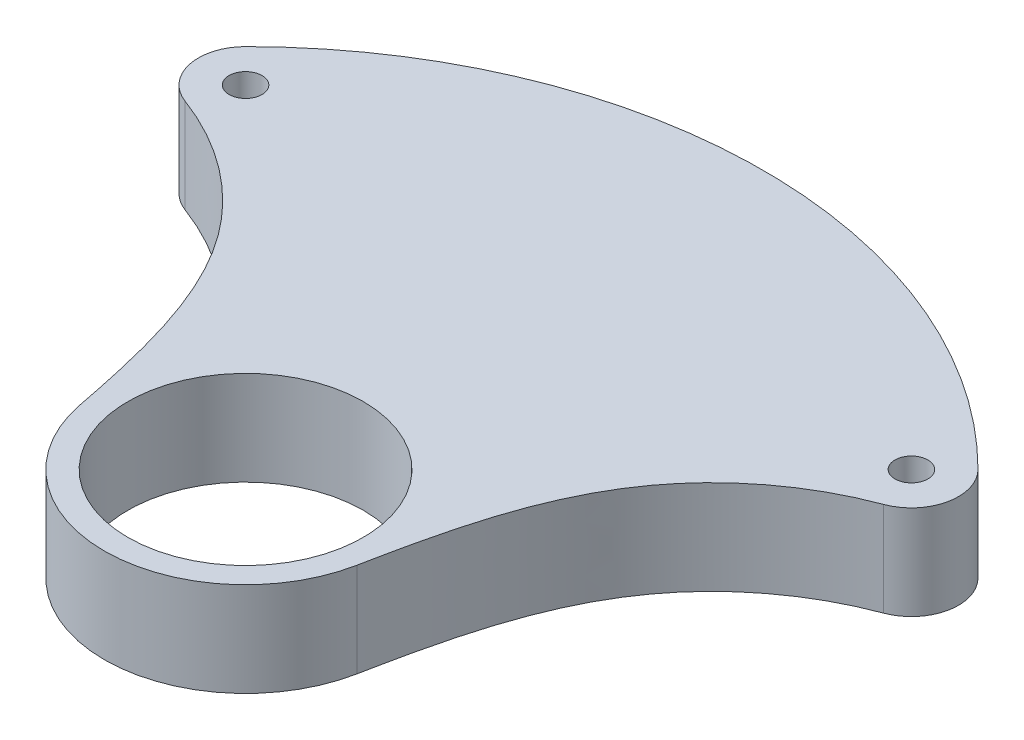
ISO-10303-21;
HEADER;
FILE_DESCRIPTION(('STEP AP214'),'2;1');
FILE_NAME('part.step','',(''),(''),'','','');
FILE_SCHEMA(('AUTOMOTIVE_DESIGN { 1 0 10303 214 1 1 1 1 }'));
ENDSEC;
DATA;
#1=APPLICATION_CONTEXT('core data for automotive mechanical design processes');
#2=APPLICATION_PROTOCOL_DEFINITION('international standard','automotive_design',2000,#1);
#3=PRODUCT_CONTEXT('',#1,'mechanical');
#4=PRODUCT('Part','Part','',(#3));
#5=PRODUCT_RELATED_PRODUCT_CATEGORY('part','',(#4));
#6=PRODUCT_DEFINITION_FORMATION('','',#4);
#7=PRODUCT_DEFINITION_CONTEXT('part definition',#1,'design');
#8=PRODUCT_DEFINITION('design','',#6,#7);
#9=PRODUCT_DEFINITION_SHAPE('','',#8);
#10=(LENGTH_UNIT() NAMED_UNIT(*) SI_UNIT(.MILLI.,.METRE.));
#11=(NAMED_UNIT(*) PLANE_ANGLE_UNIT() SI_UNIT($,.RADIAN.));
#12=(NAMED_UNIT(*) SI_UNIT($,.STERADIAN.) SOLID_ANGLE_UNIT());
#13=UNCERTAINTY_MEASURE_WITH_UNIT(LENGTH_MEASURE(1.E-05),#10,'distance_accuracy_value','');
#14=(GEOMETRIC_REPRESENTATION_CONTEXT(3) GLOBAL_UNCERTAINTY_ASSIGNED_CONTEXT((#13)) GLOBAL_UNIT_ASSIGNED_CONTEXT((#10,
#11,#12)) REPRESENTATION_CONTEXT('',''));
#15=CARTESIAN_POINT('',(0.,0.,0.));
#16=DIRECTION('',(0.,0.,1.));
#17=DIRECTION('',(1.,0.,0.));
#18=AXIS2_PLACEMENT_3D('',#15,#16,#17);
#19=CARTESIAN_POINT('',(35.3553390593274,10.,-35.3553390593273));
#20=DIRECTION('',(0.,-1.,0.));
#21=DIRECTION('',(0.,0.,-1.));
#22=AXIS2_PLACEMENT_3D('',#19,#20,#21);
#23=CYLINDRICAL_SURFACE('',#22,5.);
#24=CARTESIAN_POINT('',(35.3553390593274,0.,-35.3553390593273));
#25=DIRECTION('',(0.,1.,0.));
#26=DIRECTION('',(0.,0.,1.));
#27=AXIS2_PLACEMENT_3D('',#24,#25,#26);
#28=CIRCLE('',#27,5.);
#29=CARTESIAN_POINT('',(38.8908729652602,0.,-38.89087296526));
#30=VERTEX_POINT('',#29);
#31=CARTESIAN_POINT('',(37.1012695198472,0.,-30.6700720629834));
#32=VERTEX_POINT('',#31);
#33=EDGE_CURVE('E297',#30,#32,#28,.F.);
#34=ORIENTED_EDGE('',*,*,#33,.F.);
#35=DIRECTION('',(0.,-1.,0.));
#36=VECTOR('',#35,1.);
#37=CARTESIAN_POINT('',(38.8908729652602,10.,-38.89087296526));
#38=LINE('',#37,#36);
#39=CARTESIAN_POINT('',(38.8908729652602,10.,-38.89087296526));
#40=VERTEX_POINT('',#39);
#41=EDGE_CURVE('E169',#40,#30,#38,.T.);
#42=ORIENTED_EDGE('',*,*,#41,.F.);
#43=CARTESIAN_POINT('',(35.3553390593274,10.,-35.3553390593273));
#44=DIRECTION('',(0.,1.,0.));
#45=DIRECTION('',(0.,0.,1.));
#46=AXIS2_PLACEMENT_3D('',#43,#44,#45);
#47=CIRCLE('',#46,5.);
#48=CARTESIAN_POINT('',(37.1012695198472,10.,-30.6700720629834));
#49=VERTEX_POINT('',#48);
#50=EDGE_CURVE('E247',#40,#49,#47,.F.);
#51=ORIENTED_EDGE('',*,*,#50,.T.);
#52=DIRECTION('',(0.,-1.,0.));
#53=VECTOR('',#52,1.);
#54=CARTESIAN_POINT('',(37.1012695198472,10.,-30.6700720629834));
#55=LINE('',#54,#53);
#56=EDGE_CURVE('E12',#49,#32,#55,.T.);
#57=ORIENTED_EDGE('',*,*,#56,.T.);
#58=EDGE_LOOP('',(#34,#42,#51,#57));
#59=FACE_BOUND('',#58,.T.);
#60=ADVANCED_FACE('F158',(#59),#23,.T.);
#61=CARTESIAN_POINT('',(0.,10.,0.));
#62=DIRECTION('',(0.,-1.,0.));
#63=DIRECTION('',(0.,0.,-1.));
#64=AXIS2_PLACEMENT_3D('',#61,#62,#63);
#65=CYLINDRICAL_SURFACE('',#64,55.);
#66=CARTESIAN_POINT('',(0.,0.,0.));
#67=DIRECTION('',(0.,1.,0.));
#68=DIRECTION('',(0.,0.,1.));
#69=AXIS2_PLACEMENT_3D('',#66,#67,#68);
#70=CIRCLE('',#69,55.);
#71=CARTESIAN_POINT('',(-38.8908729652602,0.,-38.89087296526));
#72=VERTEX_POINT('',#71);
#73=EDGE_CURVE('E301',#30,#72,#70,.T.);
#74=ORIENTED_EDGE('',*,*,#73,.T.);
#75=DIRECTION('',(0.,-1.,0.));
#76=VECTOR('',#75,1.);
#77=CARTESIAN_POINT('',(-38.8908729652602,10.,-38.89087296526));
#78=LINE('',#77,#76);
#79=CARTESIAN_POINT('',(-38.8908729652602,10.,-38.89087296526));
#80=VERTEX_POINT('',#79);
#81=EDGE_CURVE('E228',#80,#72,#78,.T.);
#82=ORIENTED_EDGE('',*,*,#81,.F.);
#83=CARTESIAN_POINT('',(0.,10.,0.));
#84=DIRECTION('',(0.,1.,0.));
#85=DIRECTION('',(0.,0.,1.));
#86=AXIS2_PLACEMENT_3D('',#83,#84,#85);
#87=CIRCLE('',#86,55.);
#88=EDGE_CURVE('E237',#40,#80,#87,.T.);
#89=ORIENTED_EDGE('',*,*,#88,.F.);
#90=ORIENTED_EDGE('',*,*,#41,.T.);
#91=EDGE_LOOP('',(#74,#82,#89,#90));
#92=FACE_BOUND('',#91,.T.);
#93=ADVANCED_FACE('F265',(#92),#65,.T.);
#94=CARTESIAN_POINT('',(-37.1012695198472,10.,-30.6700720629834));
#95=CARTESIAN_POINT('',(-31.1214389404414,10.,-28.4417319565436));
#96=CARTESIAN_POINT('',(-19.5397140555229,10.,-19.3542532503672));
#97=CARTESIAN_POINT('',(-16.3006088585592,10.,-5.15524894452462));
#98=CARTESIAN_POINT('',(-14.7182727310145,10.,2.89351824177345));
#99=B_SPLINE_CURVE_WITH_KNOTS('',3,(#94,#95,#96,#97,#98),.UNSPECIFIED.,.F.,.F.,(4,1,4),(0.,
0.431745362513028,1.),.UNSPECIFIED.);
#100=DIRECTION('',(0.,-1.,0.));
#101=VECTOR('',#100,1.);
#102=SURFACE_OF_LINEAR_EXTRUSION('',#99,#101);
#103=CARTESIAN_POINT('',(-37.1012695198472,0.,-30.6700720629834));
#104=CARTESIAN_POINT('',(-31.1214389404414,0.,-28.4417319565436));
#105=CARTESIAN_POINT('',(-19.5397140555229,0.,-19.3542532503672));
#106=CARTESIAN_POINT('',(-16.3006088585592,0.,-5.15524894452462));
#107=CARTESIAN_POINT('',(-14.7182727310145,0.,2.89351824177345));
#108=B_SPLINE_CURVE_WITH_KNOTS('',3,(#103,#104,#105,#106,#107),.UNSPECIFIED.,.F.,.F.,(4,1,4),
(0.,0.431745362513028,1.),.UNSPECIFIED.);
#109=CARTESIAN_POINT('',(-37.1012695198472,0.,-30.6700720629834));
#110=VERTEX_POINT('',#109);
#111=CARTESIAN_POINT('',(-14.7182727310145,0.,2.89351824177345));
#112=VERTEX_POINT('',#111);
#113=EDGE_CURVE('E283',#110,#112,#108,.T.);
#114=ORIENTED_EDGE('',*,*,#113,.T.);
#115=DIRECTION('',(0.,-1.,0.));
#116=VECTOR('',#115,1.);
#117=CARTESIAN_POINT('',(-14.7182727310145,10.,2.89351824177345));
#118=LINE('',#117,#116);
#119=CARTESIAN_POINT('',(-14.7182727310145,10.,2.89351824177345));
#120=VERTEX_POINT('',#119);
#121=EDGE_CURVE('E197',#120,#112,#118,.T.);
#122=ORIENTED_EDGE('',*,*,#121,.F.);
#123=CARTESIAN_POINT('',(-37.1012695198472,10.,-30.6700720629834));
#124=VERTEX_POINT('',#123);
#125=EDGE_CURVE('E234',#124,#120,#99,.T.);
#126=ORIENTED_EDGE('',*,*,#125,.F.);
#127=DIRECTION('',(0.,-1.,0.));
#128=VECTOR('',#127,1.);
#129=CARTESIAN_POINT('',(-37.1012695198472,10.,-30.6700720629834));
#130=LINE('',#129,#128);
#131=EDGE_CURVE('E216',#124,#110,#130,.T.);
#132=ORIENTED_EDGE('',*,*,#131,.T.);
#133=EDGE_LOOP('',(#114,#122,#126,#132));
#134=FACE_BOUND('',#133,.T.);
#135=ADVANCED_FACE('F241',(#134),#102,.F.);
#136=CARTESIAN_POINT('',(37.1012695198472,10.,-30.6700720629834));
#137=CARTESIAN_POINT('',(31.1214389404414,10.,-28.4417319565436));
#138=CARTESIAN_POINT('',(19.5397140555229,10.,-19.3542532503672));
#139=CARTESIAN_POINT('',(16.3006088585592,10.,-5.15524894452462));
#140=CARTESIAN_POINT('',(14.7182727310145,10.,2.89351824177345));
#141=B_SPLINE_CURVE_WITH_KNOTS('',3,(#136,#137,#138,#139,#140),.UNSPECIFIED.,.F.,.F.,(4,1,4),
(0.,0.431745362513028,1.),.UNSPECIFIED.);
#142=DIRECTION('',(0.,-1.,0.));
#143=VECTOR('',#142,1.);
#144=SURFACE_OF_LINEAR_EXTRUSION('',#141,#143);
#145=CARTESIAN_POINT('',(37.1012695198472,0.,-30.6700720629834));
#146=CARTESIAN_POINT('',(31.1214389404414,0.,-28.4417319565436));
#147=CARTESIAN_POINT('',(19.5397140555229,0.,-19.3542532503672));
#148=CARTESIAN_POINT('',(16.3006088585592,0.,-5.15524894452462));
#149=CARTESIAN_POINT('',(14.7182727310145,0.,2.89351824177345));
#150=B_SPLINE_CURVE_WITH_KNOTS('',3,(#145,#146,#147,#148,#149),.UNSPECIFIED.,.F.,.F.,(4,1,4),
(0.,0.431745362513028,1.),.UNSPECIFIED.);
#151=CARTESIAN_POINT('',(14.7182727310145,0.,2.89351824177345));
#152=VERTEX_POINT('',#151);
#153=EDGE_CURVE('E239',#32,#152,#150,.T.);
#154=ORIENTED_EDGE('',*,*,#153,.F.);
#155=ORIENTED_EDGE('',*,*,#56,.F.);
#156=CARTESIAN_POINT('',(14.7182727310145,10.,2.89351824177345));
#157=VERTEX_POINT('',#156);
#158=EDGE_CURVE('E277',#49,#157,#141,.T.);
#159=ORIENTED_EDGE('',*,*,#158,.T.);
#160=DIRECTION('',(0.,-1.,0.));
#161=VECTOR('',#160,1.);
#162=CARTESIAN_POINT('',(14.7182727310145,10.,2.89351824177345));
#163=LINE('',#162,#161);
#164=EDGE_CURVE('E178',#157,#152,#163,.T.);
#165=ORIENTED_EDGE('',*,*,#164,.T.);
#166=EDGE_LOOP('',(#154,#155,#159,#165));
#167=FACE_BOUND('',#166,.T.);
#168=ADVANCED_FACE('F264',(#167),#144,.T.);
#169=CARTESIAN_POINT('',(0.,0.,0.));
#170=DIRECTION('',(0.,1.,0.));
#171=DIRECTION('',(0.,0.,1.));
#172=AXIS2_PLACEMENT_3D('',#169,#170,#171);
#173=PLANE('',#172);
#174=CARTESIAN_POINT('',(-35.3553390593274,0.,-35.3553390593273));
#175=DIRECTION('',(0.,1.,0.));
#176=DIRECTION('',(0.,0.,1.));
#177=AXIS2_PLACEMENT_3D('',#174,#175,#176);
#178=CIRCLE('',#177,1.75);
#179=CARTESIAN_POINT('',(-35.3553390593274,0.,-33.6053390593273));
#180=VERTEX_POINT('',#179);
#181=EDGE_CURVE('E328',#180,#180,#178,.F.);
#182=ORIENTED_EDGE('',*,*,#181,.F.);
#183=EDGE_LOOP('',(#182));
#184=FACE_BOUND('',#183,.T.);
#185=CARTESIAN_POINT('',(35.3553390593274,0.,-35.3553390593273));
#186=DIRECTION('',(0.,1.,0.));
#187=DIRECTION('',(0.,0.,1.));
#188=AXIS2_PLACEMENT_3D('',#185,#186,#187);
#189=CIRCLE('',#188,1.75);
#190=CARTESIAN_POINT('',(35.3553390593274,0.,-33.6053390593273));
#191=VERTEX_POINT('',#190);
#192=EDGE_CURVE('E365',#191,#191,#189,.F.);
#193=ORIENTED_EDGE('',*,*,#192,.F.);
#194=EDGE_LOOP('',(#193));
#195=FACE_BOUND('',#194,.T.);
#196=CARTESIAN_POINT('',(-35.3553390593274,0.,-35.3553390593273));
#197=DIRECTION('',(0.,1.,0.));
#198=DIRECTION('',(0.,0.,1.));
#199=AXIS2_PLACEMENT_3D('',#196,#197,#198);
#200=CIRCLE('',#199,5.);
#201=EDGE_CURVE('E222',#72,#110,#200,.T.);
#202=ORIENTED_EDGE('',*,*,#201,.F.);
#203=ORIENTED_EDGE('',*,*,#73,.F.);
#204=ORIENTED_EDGE('',*,*,#33,.T.);
#205=ORIENTED_EDGE('',*,*,#153,.T.);
#206=CARTESIAN_POINT('',(0.,0.,0.));
#207=DIRECTION('',(0.,1.,0.));
#208=DIRECTION('',(0.,0.,1.));
#209=AXIS2_PLACEMENT_3D('',#206,#207,#208);
#210=CIRCLE('',#209,15.);
#211=EDGE_CURVE('E162',#112,#152,#210,.T.);
#212=ORIENTED_EDGE('',*,*,#211,.F.);
#213=ORIENTED_EDGE('',*,*,#113,.F.);
#214=EDGE_LOOP('',(#202,#203,#204,#205,#212,#213));
#215=FACE_BOUND('',#214,.T.);
#216=CARTESIAN_POINT('',(0.,0.,0.));
#217=DIRECTION('',(0.,1.,0.));
#218=DIRECTION('',(0.,0.,1.));
#219=AXIS2_PLACEMENT_3D('',#216,#217,#218);
#220=CIRCLE('',#219,12.5);
#221=CARTESIAN_POINT('',(0.,0.,12.5));
#222=VERTEX_POINT('',#221);
#223=EDGE_CURVE('E325',#222,#222,#220,.T.);
#224=ORIENTED_EDGE('',*,*,#223,.T.);
#225=EDGE_LOOP('',(#224));
#226=FACE_BOUND('',#225,.T.);
#227=ADVANCED_FACE('F266',(#184,#195,#215,#226),#173,.F.);
#228=CARTESIAN_POINT('',(0.,10.,0.));
#229=DIRECTION('',(0.,1.,0.));
#230=DIRECTION('',(0.,0.,1.));
#231=AXIS2_PLACEMENT_3D('',#228,#229,#230);
#232=PLANE('',#231);
#233=CARTESIAN_POINT('',(-35.3553390593274,10.,-35.3553390593273));
#234=DIRECTION('',(0.,1.,0.));
#235=DIRECTION('',(0.,0.,1.));
#236=AXIS2_PLACEMENT_3D('',#233,#234,#235);
#237=CIRCLE('',#236,1.75);
#238=CARTESIAN_POINT('',(-35.3553390593274,10.,-33.6053390593273));
#239=VERTEX_POINT('',#238);
#240=EDGE_CURVE('E358',#239,#239,#237,.T.);
#241=ORIENTED_EDGE('',*,*,#240,.F.);
#242=EDGE_LOOP('',(#241));
#243=FACE_BOUND('',#242,.T.);
#244=CARTESIAN_POINT('',(35.3553390593274,10.,-35.3553390593273));
#245=DIRECTION('',(0.,1.,0.));
#246=DIRECTION('',(0.,0.,-1.));
#247=AXIS2_PLACEMENT_3D('',#244,#245,#246);
#248=CIRCLE('',#247,1.75);
#249=CARTESIAN_POINT('',(35.3553390593274,10.,-37.1053390593273));
#250=VERTEX_POINT('',#249);
#251=EDGE_CURVE('E284',#250,#250,#248,.T.);
#252=ORIENTED_EDGE('',*,*,#251,.F.);
#253=EDGE_LOOP('',(#252));
#254=FACE_BOUND('',#253,.T.);
#255=ORIENTED_EDGE('',*,*,#88,.T.);
#256=CARTESIAN_POINT('',(-35.3553390593274,10.,-35.3553390593273));
#257=DIRECTION('',(0.,1.,0.));
#258=DIRECTION('',(0.,0.,1.));
#259=AXIS2_PLACEMENT_3D('',#256,#257,#258);
#260=CIRCLE('',#259,5.);
#261=EDGE_CURVE('E219',#80,#124,#260,.T.);
#262=ORIENTED_EDGE('',*,*,#261,.T.);
#263=ORIENTED_EDGE('',*,*,#125,.T.);
#264=CARTESIAN_POINT('',(0.,10.,0.));
#265=DIRECTION('',(0.,1.,0.));
#266=DIRECTION('',(0.,0.,1.));
#267=AXIS2_PLACEMENT_3D('',#264,#265,#266);
#268=CIRCLE('',#267,15.);
#269=EDGE_CURVE('E292',#120,#157,#268,.T.);
#270=ORIENTED_EDGE('',*,*,#269,.T.);
#271=ORIENTED_EDGE('',*,*,#158,.F.);
#272=ORIENTED_EDGE('',*,*,#50,.F.);
#273=EDGE_LOOP('',(#255,#262,#263,#270,#271,#272));
#274=FACE_BOUND('',#273,.T.);
#275=CARTESIAN_POINT('',(0.,10.,0.));
#276=DIRECTION('',(0.,1.,0.));
#277=DIRECTION('',(0.,0.,1.));
#278=AXIS2_PLACEMENT_3D('',#275,#276,#277);
#279=CIRCLE('',#278,12.5);
#280=CARTESIAN_POINT('',(0.,10.,12.5));
#281=VERTEX_POINT('',#280);
#282=EDGE_CURVE('E321',#281,#281,#279,.T.);
#283=ORIENTED_EDGE('',*,*,#282,.F.);
#284=EDGE_LOOP('',(#283));
#285=FACE_BOUND('',#284,.T.);
#286=ADVANCED_FACE('F232',(#243,#254,#274,#285),#232,.T.);
#287=CARTESIAN_POINT('',(0.,10.,0.));
#288=DIRECTION('',(0.,-1.,0.));
#289=DIRECTION('',(0.,0.,-1.));
#290=AXIS2_PLACEMENT_3D('',#287,#288,#289);
#291=CYLINDRICAL_SURFACE('',#290,12.5);
#292=ORIENTED_EDGE('',*,*,#282,.T.);
#293=EDGE_LOOP('',(#292));
#294=FACE_BOUND('',#293,.T.);
#295=ORIENTED_EDGE('',*,*,#223,.F.);
#296=EDGE_LOOP('',(#295));
#297=FACE_BOUND('',#296,.T.);
#298=ADVANCED_FACE('F332',(#294,#297),#291,.F.);
#299=CARTESIAN_POINT('',(0.,10.,0.));
#300=DIRECTION('',(0.,-1.,0.));
#301=DIRECTION('',(0.,0.,-1.));
#302=AXIS2_PLACEMENT_3D('',#299,#300,#301);
#303=CYLINDRICAL_SURFACE('',#302,15.);
#304=ORIENTED_EDGE('',*,*,#164,.F.);
#305=ORIENTED_EDGE('',*,*,#269,.F.);
#306=ORIENTED_EDGE('',*,*,#121,.T.);
#307=ORIENTED_EDGE('',*,*,#211,.T.);
#308=EDGE_LOOP('',(#304,#305,#306,#307));
#309=FACE_BOUND('',#308,.T.);
#310=ADVANCED_FACE('F160',(#309),#303,.T.);
#311=CARTESIAN_POINT('',(-35.3553390593274,10.,-35.3553390593273));
#312=DIRECTION('',(0.,-1.,0.));
#313=DIRECTION('',(0.,0.,-1.));
#314=AXIS2_PLACEMENT_3D('',#311,#312,#313);
#315=CYLINDRICAL_SURFACE('',#314,5.);
#316=ORIENTED_EDGE('',*,*,#131,.F.);
#317=ORIENTED_EDGE('',*,*,#261,.F.);
#318=ORIENTED_EDGE('',*,*,#81,.T.);
#319=ORIENTED_EDGE('',*,*,#201,.T.);
#320=EDGE_LOOP('',(#316,#317,#318,#319));
#321=FACE_BOUND('',#320,.T.);
#322=ADVANCED_FACE('F218',(#321),#315,.T.);
#323=CARTESIAN_POINT('',(35.3553390593274,-0.000999999999999265,-35.3553390593273));
#324=DIRECTION('',(0.,1.,0.));
#325=DIRECTION('',(0.,0.,1.));
#326=AXIS2_PLACEMENT_3D('',#323,#324,#325);
#327=CYLINDRICAL_SURFACE('',#326,1.75);
#328=ORIENTED_EDGE('',*,*,#251,.T.);
#329=EDGE_LOOP('',(#328));
#330=FACE_BOUND('',#329,.T.);
#331=ORIENTED_EDGE('',*,*,#192,.T.);
#332=EDGE_LOOP('',(#331));
#333=FACE_BOUND('',#332,.T.);
#334=ADVANCED_FACE('F337',(#330,#333),#327,.F.);
#335=CARTESIAN_POINT('',(-35.3553390593274,-0.000999999999999265,-35.3553390593273));
#336=DIRECTION('',(0.,1.,0.));
#337=DIRECTION('',(0.,0.,1.));
#338=AXIS2_PLACEMENT_3D('',#335,#336,#337);
#339=CYLINDRICAL_SURFACE('',#338,1.75);
#340=ORIENTED_EDGE('',*,*,#240,.T.);
#341=EDGE_LOOP('',(#340));
#342=FACE_BOUND('',#341,.T.);
#343=ORIENTED_EDGE('',*,*,#181,.T.);
#344=EDGE_LOOP('',(#343));
#345=FACE_BOUND('',#344,.T.);
#346=ADVANCED_FACE('F350',(#342,#345),#339,.F.);
#347=CLOSED_SHELL('',(#60,#93,#135,#168,#227,#286,#298,#310,#322,#334,#346));
#348=MANIFOLD_SOLID_BREP('B2',#347);
#349=ADVANCED_BREP_SHAPE_REPRESENTATION('',(#18,#348),#14);
#350=SHAPE_DEFINITION_REPRESENTATION(#9,#349);
ENDSEC;
END-ISO-10303-21;
